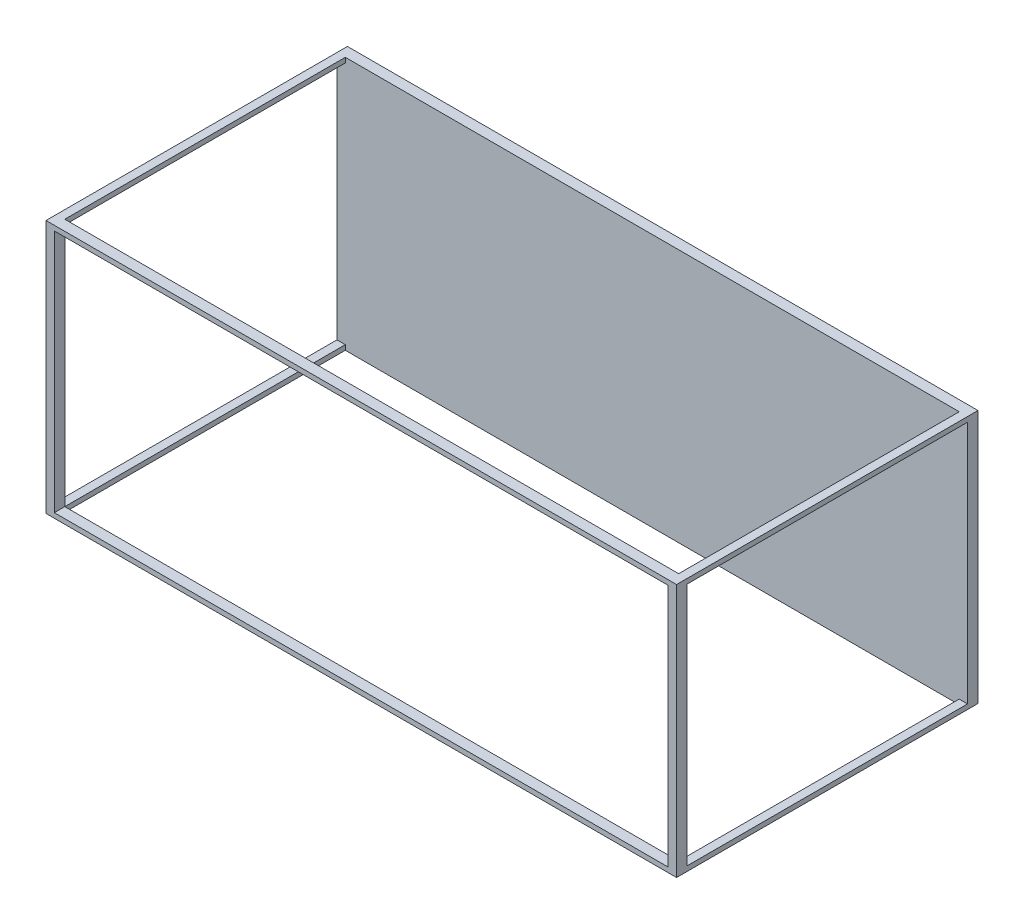
ISO-10303-21;
HEADER;
FILE_DESCRIPTION(('STEP AP214'),'2;1');
FILE_NAME('part.step','',(''),(''),'','','');
FILE_SCHEMA(('AUTOMOTIVE_DESIGN { 1 0 10303 214 1 1 1 1 }'));
ENDSEC;
DATA;
#1=APPLICATION_CONTEXT('core data for automotive mechanical design processes');
#2=APPLICATION_PROTOCOL_DEFINITION('international standard','automotive_design',2000,#1);
#3=PRODUCT_CONTEXT('',#1,'mechanical');
#4=PRODUCT('Part','Part','',(#3));
#5=PRODUCT_RELATED_PRODUCT_CATEGORY('part','',(#4));
#6=PRODUCT_DEFINITION_FORMATION('','',#4);
#7=PRODUCT_DEFINITION_CONTEXT('part definition',#1,'design');
#8=PRODUCT_DEFINITION('design','',#6,#7);
#9=PRODUCT_DEFINITION_SHAPE('','',#8);
#10=(LENGTH_UNIT() NAMED_UNIT(*) SI_UNIT(.MILLI.,.METRE.));
#11=(NAMED_UNIT(*) PLANE_ANGLE_UNIT() SI_UNIT($,.RADIAN.));
#12=(NAMED_UNIT(*) SI_UNIT($,.STERADIAN.) SOLID_ANGLE_UNIT());
#13=UNCERTAINTY_MEASURE_WITH_UNIT(LENGTH_MEASURE(1.E-05),#10,'distance_accuracy_value','');
#14=(GEOMETRIC_REPRESENTATION_CONTEXT(3) GLOBAL_UNCERTAINTY_ASSIGNED_CONTEXT((#13)) GLOBAL_UNIT_ASSIGNED_CONTEXT((#10,
#11,#12)) REPRESENTATION_CONTEXT('',''));
#15=CARTESIAN_POINT('',(0.,0.,0.));
#16=DIRECTION('',(0.,0.,1.));
#17=DIRECTION('',(1.,0.,0.));
#18=AXIS2_PLACEMENT_3D('',#15,#16,#17);
#19=CARTESIAN_POINT('',(-2964.25801526717,1439.12366412214,0.));
#20=DIRECTION('',(1.,0.,0.));
#21=DIRECTION('',(0.,0.,-1.));
#22=AXIS2_PLACEMENT_3D('',#19,#20,#21);
#23=PLANE('',#22);
#24=DIRECTION('',(0.,0.,-1.));
#25=VECTOR('',#24,1.);
#26=CARTESIAN_POINT('',(-2964.25801526717,-951.876335877863,2.95496465886317E-13));
#27=LINE('',#26,#25);
#28=CARTESIAN_POINT('',(-2964.25801526718,-951.876335877863,2795.5));
#29=VERTEX_POINT('',#28);
#30=CARTESIAN_POINT('',(-2964.25801526718,-951.876335877863,100.500000000001));
#31=VERTEX_POINT('',#30);
#32=EDGE_CURVE('E210',#29,#31,#27,.T.);
#33=ORIENTED_EDGE('',*,*,#32,.F.);
#34=DIRECTION('',(0.,-1.,0.));
#35=VECTOR('',#34,1.);
#36=CARTESIAN_POINT('',(-2964.25801526717,1439.12366412214,2795.5));
#37=LINE('',#36,#35);
#38=CARTESIAN_POINT('',(-2964.25801526717,-998.876335877863,2795.5));
#39=VERTEX_POINT('',#38);
#40=EDGE_CURVE('E275',#29,#39,#37,.T.);
#41=ORIENTED_EDGE('',*,*,#40,.T.);
#42=DIRECTION('',(0.,0.,1.));
#43=VECTOR('',#42,1.);
#44=CARTESIAN_POINT('',(-2964.25801526717,-998.876335877863,0.));
#45=LINE('',#44,#43);
#46=CARTESIAN_POINT('',(-2964.25801526717,-998.876335877863,100.5));
#47=VERTEX_POINT('',#46);
#48=EDGE_CURVE('E248',#47,#39,#45,.T.);
#49=ORIENTED_EDGE('',*,*,#48,.F.);
#50=DIRECTION('',(0.,-1.,0.));
#51=VECTOR('',#50,1.);
#52=CARTESIAN_POINT('',(-2964.25801526717,1439.12366412214,100.5));
#53=LINE('',#52,#51);
#54=EDGE_CURVE('E271',#31,#47,#53,.T.);
#55=ORIENTED_EDGE('',*,*,#54,.F.);
#56=EDGE_LOOP('',(#33,#41,#49,#55));
#57=FACE_BOUND('',#56,.T.);
#58=ADVANCED_FACE('F36',(#57),#23,.T.);
#59=DIRECTION('',(0.,-1.,0.));
#60=VECTOR('',#59,1.);
#61=CARTESIAN_POINT('',(-2964.25801526717,1439.12366412214,2795.5));
#62=LINE('',#61,#60);
#63=CARTESIAN_POINT('',(-2964.25801526718,1392.12366412214,2795.5));
#64=VERTEX_POINT('',#63);
#65=EDGE_CURVE('E197',#64,#29,#62,.T.);
#66=ORIENTED_EDGE('',*,*,#65,.F.);
#67=DIRECTION('',(0.,0.,-1.));
#68=VECTOR('',#67,1.);
#69=CARTESIAN_POINT('',(-2964.25801526718,1392.12366412214,2896.000012));
#70=LINE('',#69,#68);
#71=CARTESIAN_POINT('',(-2964.25801526718,1392.12366412214,2896.));
#72=VERTEX_POINT('',#71);
#73=EDGE_CURVE('E218',#72,#64,#70,.T.);
#74=ORIENTED_EDGE('',*,*,#73,.F.);
#75=DIRECTION('',(0.,-1.,0.));
#76=VECTOR('',#75,1.);
#77=CARTESIAN_POINT('',(-2964.25801526718,-5.61601962368479E-13,2896.));
#78=LINE('',#77,#76);
#79=CARTESIAN_POINT('',(-2964.25801526718,-951.876335877862,2896.));
#80=VERTEX_POINT('',#79);
#81=EDGE_CURVE('E238',#72,#80,#78,.T.);
#82=ORIENTED_EDGE('',*,*,#81,.T.);
#83=DIRECTION('',(0.,0.,-1.));
#84=VECTOR('',#83,1.);
#85=CARTESIAN_POINT('',(-2964.25801526718,-951.876335877862,2896.000012));
#86=LINE('',#85,#84);
#87=EDGE_CURVE('E215',#80,#29,#86,.T.);
#88=ORIENTED_EDGE('',*,*,#87,.T.);
#89=EDGE_LOOP('',(#66,#74,#82,#88));
#90=FACE_BOUND('',#89,.T.);
#91=ADVANCED_FACE('F343',(#90),#23,.T.);
#92=CARTESIAN_POINT('',(2933.74198473283,1439.12366412214,0.));
#93=DIRECTION('',(1.,0.,0.));
#94=DIRECTION('',(0.,0.,-1.));
#95=AXIS2_PLACEMENT_3D('',#92,#93,#94);
#96=PLANE('',#95);
#97=DIRECTION('',(0.,-1.,0.));
#98=VECTOR('',#97,1.);
#99=CARTESIAN_POINT('',(2933.74198473283,1439.12366412214,2795.5));
#100=LINE('',#99,#98);
#101=CARTESIAN_POINT('',(2933.74198473282,-951.876335877861,2795.5));
#102=VERTEX_POINT('',#101);
#103=CARTESIAN_POINT('',(2933.74198473283,-998.876335877863,2795.5));
#104=VERTEX_POINT('',#103);
#105=EDGE_CURVE('E279',#102,#104,#100,.T.);
#106=ORIENTED_EDGE('',*,*,#105,.F.);
#107=DIRECTION('',(0.,0.,-1.));
#108=VECTOR('',#107,1.);
#109=CARTESIAN_POINT('',(2933.74198473283,-951.876335877862,2.95496465886317E-13));
#110=LINE('',#109,#108);
#111=CARTESIAN_POINT('',(2933.74198473283,-951.876335877862,100.500000000001));
#112=VERTEX_POINT('',#111);
#113=EDGE_CURVE('E11',#102,#112,#110,.T.);
#114=ORIENTED_EDGE('',*,*,#113,.T.);
#115=DIRECTION('',(0.,-1.,0.));
#116=VECTOR('',#115,1.);
#117=CARTESIAN_POINT('',(2933.74198473283,1439.12366412214,100.5));
#118=LINE('',#117,#116);
#119=CARTESIAN_POINT('',(2933.74198473282,-998.876335877863,100.5));
#120=VERTEX_POINT('',#119);
#121=EDGE_CURVE('E256',#112,#120,#118,.T.);
#122=ORIENTED_EDGE('',*,*,#121,.T.);
#123=DIRECTION('',(0.,0.,1.));
#124=VECTOR('',#123,1.);
#125=CARTESIAN_POINT('',(2933.74198473283,-998.876335877863,0.));
#126=LINE('',#125,#124);
#127=EDGE_CURVE('E259',#120,#104,#126,.T.);
#128=ORIENTED_EDGE('',*,*,#127,.T.);
#129=EDGE_LOOP('',(#106,#114,#122,#128));
#130=FACE_BOUND('',#129,.T.);
#131=ADVANCED_FACE('F395',(#130),#96,.F.);
#132=DIRECTION('',(0.,0.,-1.));
#133=VECTOR('',#132,1.);
#134=CARTESIAN_POINT('',(2933.74198473282,1392.12366412214,2896.000012));
#135=LINE('',#134,#133);
#136=CARTESIAN_POINT('',(2933.74198473282,1392.12366412214,2896.));
#137=VERTEX_POINT('',#136);
#138=CARTESIAN_POINT('',(2933.74198473282,1392.12366412214,2795.5));
#139=VERTEX_POINT('',#138);
#140=EDGE_CURVE('E221',#137,#139,#135,.T.);
#141=ORIENTED_EDGE('',*,*,#140,.T.);
#142=DIRECTION('',(0.,-1.,0.));
#143=VECTOR('',#142,1.);
#144=CARTESIAN_POINT('',(2933.74198473283,1439.12366412214,2795.5));
#145=LINE('',#144,#143);
#146=EDGE_CURVE('E170',#139,#102,#145,.T.);
#147=ORIENTED_EDGE('',*,*,#146,.T.);
#148=DIRECTION('',(0.,0.,-1.));
#149=VECTOR('',#148,1.);
#150=CARTESIAN_POINT('',(2933.74198473282,-951.876335877862,2896.000012));
#151=LINE('',#150,#149);
#152=CARTESIAN_POINT('',(2933.74198473282,-951.876335877862,2896.));
#153=VERTEX_POINT('',#152);
#154=EDGE_CURVE('E224',#153,#102,#151,.T.);
#155=ORIENTED_EDGE('',*,*,#154,.F.);
#156=DIRECTION('',(0.,-1.,0.));
#157=VECTOR('',#156,1.);
#158=CARTESIAN_POINT('',(2933.74198473282,0.,2896.));
#159=LINE('',#158,#157);
#160=EDGE_CURVE('E240',#137,#153,#159,.T.);
#161=ORIENTED_EDGE('',*,*,#160,.F.);
#162=EDGE_LOOP('',(#141,#147,#155,#161));
#163=FACE_BOUND('',#162,.T.);
#164=ADVANCED_FACE('F322',(#163),#96,.F.);
#165=CARTESIAN_POINT('',(0.,0.,2896.));
#166=DIRECTION('',(0.,0.,-1.));
#167=DIRECTION('',(-1.,0.,0.));
#168=AXIS2_PLACEMENT_3D('',#165,#166,#167);
#169=PLANE('',#168);
#170=DIRECTION('',(1.,0.,0.));
#171=VECTOR('',#170,1.);
#172=CARTESIAN_POINT('',(-3044.25801526718,-998.876335877863,2896.));
#173=LINE('',#172,#171);
#174=CARTESIAN_POINT('',(-3044.25801526718,-998.876335877863,2896.));
#175=VERTEX_POINT('',#174);
#176=CARTESIAN_POINT('',(3013.74198473282,-998.876335877863,2896.));
#177=VERTEX_POINT('',#176);
#178=EDGE_CURVE('E283',#175,#177,#173,.T.);
#179=ORIENTED_EDGE('',*,*,#178,.T.);
#180=DIRECTION('',(0.,-1.,0.));
#181=VECTOR('',#180,1.);
#182=CARTESIAN_POINT('',(3013.74198473282,1439.12366412214,2896.));
#183=LINE('',#182,#181);
#184=CARTESIAN_POINT('',(3013.74198473282,1439.12366412214,2896.));
#185=VERTEX_POINT('',#184);
#186=EDGE_CURVE('E285',#185,#177,#183,.T.);
#187=ORIENTED_EDGE('',*,*,#186,.F.);
#188=DIRECTION('',(1.,0.,0.));
#189=VECTOR('',#188,1.);
#190=CARTESIAN_POINT('',(-3044.25801526718,1439.12366412214,2896.));
#191=LINE('',#190,#189);
#192=CARTESIAN_POINT('',(-3044.25801526718,1439.12366412214,2896.));
#193=VERTEX_POINT('',#192);
#194=EDGE_CURVE('E289',#193,#185,#191,.T.);
#195=ORIENTED_EDGE('',*,*,#194,.F.);
#196=DIRECTION('',(0.,-1.,0.));
#197=VECTOR('',#196,1.);
#198=CARTESIAN_POINT('',(-3044.25801526718,1439.12366412214,2896.));
#199=LINE('',#198,#197);
#200=EDGE_CURVE('E292',#193,#175,#199,.T.);
#201=ORIENTED_EDGE('',*,*,#200,.T.);
#202=EDGE_LOOP('',(#179,#187,#195,#201));
#203=FACE_BOUND('',#202,.T.);
#204=DIRECTION('',(1.,0.,0.));
#205=VECTOR('',#204,1.);
#206=CARTESIAN_POINT('',(0.,-951.876335877862,2896.));
#207=LINE('',#206,#205);
#208=EDGE_CURVE('E236',#80,#153,#207,.T.);
#209=ORIENTED_EDGE('',*,*,#208,.F.);
#210=ORIENTED_EDGE('',*,*,#81,.F.);
#211=DIRECTION('',(1.,0.,0.));
#212=VECTOR('',#211,1.);
#213=CARTESIAN_POINT('',(0.,1392.12366412214,2896.));
#214=LINE('',#213,#212);
#215=EDGE_CURVE('E230',#72,#137,#214,.T.);
#216=ORIENTED_EDGE('',*,*,#215,.T.);
#217=ORIENTED_EDGE('',*,*,#160,.T.);
#218=EDGE_LOOP('',(#209,#210,#216,#217));
#219=FACE_BOUND('',#218,.T.);
#220=ADVANCED_FACE('F383',(#203,#219),#169,.F.);
#221=CARTESIAN_POINT('',(0.,1439.12366412214,2795.5));
#222=DIRECTION('',(0.,0.,-1.));
#223=DIRECTION('',(-1.,0.,0.));
#224=AXIS2_PLACEMENT_3D('',#221,#222,#223);
#225=PLANE('',#224);
#226=ORIENTED_EDGE('',*,*,#40,.F.);
#227=DIRECTION('',(1.,0.,0.));
#228=VECTOR('',#227,1.);
#229=CARTESIAN_POINT('',(0.,-951.876335877862,2795.5));
#230=LINE('',#229,#228);
#231=EDGE_CURVE('E233',#29,#102,#230,.T.);
#232=ORIENTED_EDGE('',*,*,#231,.T.);
#233=ORIENTED_EDGE('',*,*,#105,.T.);
#234=DIRECTION('',(1.,0.,0.));
#235=VECTOR('',#234,1.);
#236=CARTESIAN_POINT('',(0.,-998.876335877863,2795.5));
#237=LINE('',#236,#235);
#238=EDGE_CURVE('E262',#39,#104,#237,.T.);
#239=ORIENTED_EDGE('',*,*,#238,.F.);
#240=EDGE_LOOP('',(#226,#232,#233,#239));
#241=FACE_BOUND('',#240,.T.);
#242=ADVANCED_FACE('F354',(#241),#225,.T.);
#243=CARTESIAN_POINT('',(-3044.25801526718,-998.876335877863,2896.));
#244=DIRECTION('',(0.,1.,0.));
#245=DIRECTION('',(0.,0.,1.));
#246=AXIS2_PLACEMENT_3D('',#243,#244,#245);
#247=PLANE('',#246);
#248=ORIENTED_EDGE('',*,*,#127,.F.);
#249=DIRECTION('',(1.,0.,0.));
#250=VECTOR('',#249,1.);
#251=CARTESIAN_POINT('',(0.,-998.876335877863,100.5));
#252=LINE('',#251,#250);
#253=EDGE_CURVE('E243',#47,#120,#252,.T.);
#254=ORIENTED_EDGE('',*,*,#253,.F.);
#255=ORIENTED_EDGE('',*,*,#48,.T.);
#256=ORIENTED_EDGE('',*,*,#238,.T.);
#257=EDGE_LOOP('',(#248,#254,#255,#256));
#258=FACE_BOUND('',#257,.T.);
#259=DIRECTION('',(1.,0.,0.));
#260=VECTOR('',#259,1.);
#261=CARTESIAN_POINT('',(-3044.25801526718,-998.876335877863,0.));
#262=LINE('',#261,#260);
#263=CARTESIAN_POINT('',(-3044.25801526718,-998.876335877863,0.));
#264=VERTEX_POINT('',#263);
#265=CARTESIAN_POINT('',(3013.74198473282,-998.876335877863,0.));
#266=VERTEX_POINT('',#265);
#267=EDGE_CURVE('E270',#264,#266,#262,.T.);
#268=ORIENTED_EDGE('',*,*,#267,.T.);
#269=DIRECTION('',(0.,0.,-1.));
#270=VECTOR('',#269,1.);
#271=CARTESIAN_POINT('',(3013.74198473282,-998.876335877863,2896.));
#272=LINE('',#271,#270);
#273=EDGE_CURVE('E310',#177,#266,#272,.T.);
#274=ORIENTED_EDGE('',*,*,#273,.F.);
#275=ORIENTED_EDGE('',*,*,#178,.F.);
#276=DIRECTION('',(0.,0.,-1.));
#277=VECTOR('',#276,1.);
#278=CARTESIAN_POINT('',(-3044.25801526718,-998.876335877863,2896.));
#279=LINE('',#278,#277);
#280=EDGE_CURVE('E294',#175,#264,#279,.T.);
#281=ORIENTED_EDGE('',*,*,#280,.T.);
#282=EDGE_LOOP('',(#268,#274,#275,#281));
#283=FACE_BOUND('',#282,.T.);
#284=ADVANCED_FACE('F38',(#258,#283),#247,.F.);
#285=CARTESIAN_POINT('',(3013.74198473282,1439.12366412214,2896.));
#286=DIRECTION('',(1.,0.,0.));
#287=DIRECTION('',(0.,1.,0.));
#288=AXIS2_PLACEMENT_3D('',#285,#286,#287);
#289=PLANE('',#288);
#290=DIRECTION('',(0.,1.,0.));
#291=VECTOR('',#290,1.);
#292=CARTESIAN_POINT('',(3013.74198473282,1392.12366412214,2795.5));
#293=LINE('',#292,#291);
#294=CARTESIAN_POINT('',(3013.74198473282,-951.876335877861,2795.5));
#295=VERTEX_POINT('',#294);
#296=CARTESIAN_POINT('',(3013.74198473282,1392.12366412214,2795.5));
#297=VERTEX_POINT('',#296);
#298=EDGE_CURVE('E167',#295,#297,#293,.T.);
#299=ORIENTED_EDGE('',*,*,#298,.T.);
#300=DIRECTION('',(0.,0.,-1.));
#301=VECTOR('',#300,1.);
#302=CARTESIAN_POINT('',(3013.74198473282,1392.12366412214,2795.5));
#303=LINE('',#302,#301);
#304=CARTESIAN_POINT('',(3013.74198473282,1392.12366412214,100.5));
#305=VERTEX_POINT('',#304);
#306=EDGE_CURVE('E176',#297,#305,#303,.T.);
#307=ORIENTED_EDGE('',*,*,#306,.T.);
#308=DIRECTION('',(0.,-1.,0.));
#309=VECTOR('',#308,1.);
#310=CARTESIAN_POINT('',(3013.74198473282,1392.12366412214,100.5));
#311=LINE('',#310,#309);
#312=CARTESIAN_POINT('',(3013.74198473282,-951.876335877862,100.500000000001));
#313=VERTEX_POINT('',#312);
#314=EDGE_CURVE('E51',#305,#313,#311,.T.);
#315=ORIENTED_EDGE('',*,*,#314,.T.);
#316=DIRECTION('',(0.,0.,1.));
#317=VECTOR('',#316,1.);
#318=CARTESIAN_POINT('',(3013.74198473282,-951.876335877861,2795.5));
#319=LINE('',#318,#317);
#320=EDGE_CURVE('E184',#313,#295,#319,.T.);
#321=ORIENTED_EDGE('',*,*,#320,.T.);
#322=EDGE_LOOP('',(#299,#307,#315,#321));
#323=FACE_BOUND('',#322,.T.);
#324=DIRECTION('',(0.,-1.,0.));
#325=VECTOR('',#324,1.);
#326=CARTESIAN_POINT('',(3013.74198473282,1439.12366412214,0.));
#327=LINE('',#326,#325);
#328=CARTESIAN_POINT('',(3013.74198473282,1439.12366412214,0.));
#329=VERTEX_POINT('',#328);
#330=EDGE_CURVE('E297',#329,#266,#327,.T.);
#331=ORIENTED_EDGE('',*,*,#330,.F.);
#332=DIRECTION('',(0.,0.,-1.));
#333=VECTOR('',#332,1.);
#334=CARTESIAN_POINT('',(3013.74198473282,1439.12366412214,2896.));
#335=LINE('',#334,#333);
#336=EDGE_CURVE('E308',#185,#329,#335,.T.);
#337=ORIENTED_EDGE('',*,*,#336,.F.);
#338=ORIENTED_EDGE('',*,*,#186,.T.);
#339=ORIENTED_EDGE('',*,*,#273,.T.);
#340=EDGE_LOOP('',(#331,#337,#338,#339));
#341=FACE_BOUND('',#340,.T.);
#342=ADVANCED_FACE('F181',(#323,#341),#289,.T.);
#343=CARTESIAN_POINT('',(-3044.25801526718,1439.12366412214,2896.));
#344=DIRECTION('',(0.,1.,0.));
#345=DIRECTION('',(0.,0.,1.));
#346=AXIS2_PLACEMENT_3D('',#343,#344,#345);
#347=PLANE('',#346);
#348=DIRECTION('',(1.,0.,0.));
#349=VECTOR('',#348,1.);
#350=CARTESIAN_POINT('',(0.,1439.12366412214,100.5));
#351=LINE('',#350,#349);
#352=CARTESIAN_POINT('',(-2964.25801526717,1439.12366412214,100.5));
#353=VERTEX_POINT('',#352);
#354=CARTESIAN_POINT('',(2933.74198473283,1439.12366412214,100.5));
#355=VERTEX_POINT('',#354);
#356=EDGE_CURVE('E244',#353,#355,#351,.T.);
#357=ORIENTED_EDGE('',*,*,#356,.T.);
#358=DIRECTION('',(0.,0.,1.));
#359=VECTOR('',#358,1.);
#360=CARTESIAN_POINT('',(2933.74198473283,1439.12366412214,0.));
#361=LINE('',#360,#359);
#362=CARTESIAN_POINT('',(2933.74198473283,1439.12366412214,2795.5));
#363=VERTEX_POINT('',#362);
#364=EDGE_CURVE('E247',#355,#363,#361,.T.);
#365=ORIENTED_EDGE('',*,*,#364,.T.);
#366=DIRECTION('',(1.,0.,0.));
#367=VECTOR('',#366,1.);
#368=CARTESIAN_POINT('',(0.,1439.12366412214,2795.5));
#369=LINE('',#368,#367);
#370=CARTESIAN_POINT('',(-2964.25801526717,1439.12366412214,2795.5));
#371=VERTEX_POINT('',#370);
#372=EDGE_CURVE('E251',#371,#363,#369,.T.);
#373=ORIENTED_EDGE('',*,*,#372,.F.);
#374=DIRECTION('',(0.,0.,1.));
#375=VECTOR('',#374,1.);
#376=CARTESIAN_POINT('',(-2964.25801526717,1439.12366412214,0.));
#377=LINE('',#376,#375);
#378=EDGE_CURVE('E254',#353,#371,#377,.T.);
#379=ORIENTED_EDGE('',*,*,#378,.F.);
#380=EDGE_LOOP('',(#357,#365,#373,#379));
#381=FACE_BOUND('',#380,.T.);
#382=DIRECTION('',(1.,0.,0.));
#383=VECTOR('',#382,1.);
#384=CARTESIAN_POINT('',(-3044.25801526718,1439.12366412214,0.));
#385=LINE('',#384,#383);
#386=CARTESIAN_POINT('',(-3044.25801526718,1439.12366412214,0.));
#387=VERTEX_POINT('',#386);
#388=EDGE_CURVE('E300',#387,#329,#385,.T.);
#389=ORIENTED_EDGE('',*,*,#388,.F.);
#390=DIRECTION('',(0.,0.,-1.));
#391=VECTOR('',#390,1.);
#392=CARTESIAN_POINT('',(-3044.25801526718,1439.12366412214,2896.));
#393=LINE('',#392,#391);
#394=EDGE_CURVE('E306',#193,#387,#393,.T.);
#395=ORIENTED_EDGE('',*,*,#394,.F.);
#396=ORIENTED_EDGE('',*,*,#194,.T.);
#397=ORIENTED_EDGE('',*,*,#336,.T.);
#398=EDGE_LOOP('',(#389,#395,#396,#397));
#399=FACE_BOUND('',#398,.T.);
#400=ADVANCED_FACE('F328',(#381,#399),#347,.T.);
#401=CARTESIAN_POINT('',(-3044.25801526718,1439.12366412214,2896.));
#402=DIRECTION('',(1.,0.,0.));
#403=DIRECTION('',(0.,1.,0.));
#404=AXIS2_PLACEMENT_3D('',#401,#402,#403);
#405=PLANE('',#404);
#406=DIRECTION('',(0.,0.,1.));
#407=VECTOR('',#406,1.);
#408=CARTESIAN_POINT('',(-3044.25801526718,1392.12366412214,2896.));
#409=LINE('',#408,#407);
#410=CARTESIAN_POINT('',(-3044.25801526718,1392.12366412214,100.5));
#411=VERTEX_POINT('',#410);
#412=CARTESIAN_POINT('',(-3044.25801526718,1392.12366412214,2795.5));
#413=VERTEX_POINT('',#412);
#414=EDGE_CURVE('E204',#411,#413,#409,.T.);
#415=ORIENTED_EDGE('',*,*,#414,.T.);
#416=DIRECTION('',(0.,-1.,0.));
#417=VECTOR('',#416,1.);
#418=CARTESIAN_POINT('',(-3044.25801526718,1439.12366412214,2795.5));
#419=LINE('',#418,#417);
#420=CARTESIAN_POINT('',(-3044.25801526718,-951.876335877863,2795.5));
#421=VERTEX_POINT('',#420);
#422=EDGE_CURVE('E199',#413,#421,#419,.T.);
#423=ORIENTED_EDGE('',*,*,#422,.T.);
#424=DIRECTION('',(0.,0.,-1.));
#425=VECTOR('',#424,1.);
#426=CARTESIAN_POINT('',(-3044.25801526718,-951.876335877862,2896.));
#427=LINE('',#426,#425);
#428=CARTESIAN_POINT('',(-3044.25801526718,-951.876335877863,100.500000000001));
#429=VERTEX_POINT('',#428);
#430=EDGE_CURVE('E212',#421,#429,#427,.T.);
#431=ORIENTED_EDGE('',*,*,#430,.T.);
#432=DIRECTION('',(0.,1.,0.));
#433=VECTOR('',#432,1.);
#434=CARTESIAN_POINT('',(-3044.25801526718,1439.12366412214,100.5));
#435=LINE('',#434,#433);
#436=EDGE_CURVE('E207',#429,#411,#435,.T.);
#437=ORIENTED_EDGE('',*,*,#436,.T.);
#438=EDGE_LOOP('',(#415,#423,#431,#437));
#439=FACE_BOUND('',#438,.T.);
#440=DIRECTION('',(0.,-1.,0.));
#441=VECTOR('',#440,1.);
#442=CARTESIAN_POINT('',(-3044.25801526718,1439.12366412214,0.));
#443=LINE('',#442,#441);
#444=EDGE_CURVE('E286',#387,#264,#443,.T.);
#445=ORIENTED_EDGE('',*,*,#444,.T.);
#446=ORIENTED_EDGE('',*,*,#280,.F.);
#447=ORIENTED_EDGE('',*,*,#200,.F.);
#448=ORIENTED_EDGE('',*,*,#394,.T.);
#449=EDGE_LOOP('',(#445,#446,#447,#448));
#450=FACE_BOUND('',#449,.T.);
#451=ADVANCED_FACE('F365',(#439,#450),#405,.F.);
#452=CARTESIAN_POINT('',(0.,0.,0.));
#453=DIRECTION('',(0.,0.,-1.));
#454=DIRECTION('',(-1.,0.,0.));
#455=AXIS2_PLACEMENT_3D('',#452,#453,#454);
#456=PLANE('',#455);
#457=ORIENTED_EDGE('',*,*,#267,.F.);
#458=ORIENTED_EDGE('',*,*,#444,.F.);
#459=ORIENTED_EDGE('',*,*,#388,.T.);
#460=ORIENTED_EDGE('',*,*,#330,.T.);
#461=EDGE_LOOP('',(#457,#458,#459,#460));
#462=FACE_BOUND('',#461,.T.);
#463=ADVANCED_FACE('F368',(#462),#456,.T.);
#464=CARTESIAN_POINT('',(0.,1439.12366412214,100.5));
#465=DIRECTION('',(0.,0.,-1.));
#466=DIRECTION('',(-1.,0.,0.));
#467=AXIS2_PLACEMENT_3D('',#464,#465,#466);
#468=PLANE('',#467);
#469=CARTESIAN_POINT('',(-2964.25801526717,1392.12366412214,100.5));
#470=VERTEX_POINT('',#469);
#471=EDGE_CURVE('E267',#353,#470,#53,.T.);
#472=ORIENTED_EDGE('',*,*,#471,.T.);
#473=DIRECTION('',(-1.,0.,0.));
#474=VECTOR('',#473,1.);
#475=CARTESIAN_POINT('',(3013.74198473282,1392.12366412214,100.5));
#476=LINE('',#475,#474);
#477=EDGE_CURVE('E173',#470,#411,#476,.T.);
#478=ORIENTED_EDGE('',*,*,#477,.T.);
#479=ORIENTED_EDGE('',*,*,#436,.F.);
#480=DIRECTION('',(-1.,0.,0.));
#481=VECTOR('',#480,1.);
#482=CARTESIAN_POINT('',(3013.74198473282,-951.876335877862,100.500000000001));
#483=LINE('',#482,#481);
#484=EDGE_CURVE('E194',#31,#429,#483,.T.);
#485=ORIENTED_EDGE('',*,*,#484,.F.);
#486=ORIENTED_EDGE('',*,*,#54,.T.);
#487=ORIENTED_EDGE('',*,*,#253,.T.);
#488=ORIENTED_EDGE('',*,*,#121,.F.);
#489=EDGE_CURVE('E192',#313,#112,#483,.T.);
#490=ORIENTED_EDGE('',*,*,#489,.F.);
#491=ORIENTED_EDGE('',*,*,#314,.F.);
#492=CARTESIAN_POINT('',(2933.74198473283,1392.12366412214,100.5));
#493=VERTEX_POINT('',#492);
#494=EDGE_CURVE('E178',#305,#493,#476,.T.);
#495=ORIENTED_EDGE('',*,*,#494,.T.);
#496=EDGE_CURVE('E280',#355,#493,#118,.T.);
#497=ORIENTED_EDGE('',*,*,#496,.F.);
#498=ORIENTED_EDGE('',*,*,#356,.F.);
#499=EDGE_LOOP('',(#472,#478,#479,#485,#486,#487,#488,#490,#491,#495,#497,#498));
#500=FACE_BOUND('',#499,.T.);
#501=ADVANCED_FACE('F331',(#500),#468,.F.);
#502=DIRECTION('',(0.,0.,1.));
#503=VECTOR('',#502,1.);
#504=CARTESIAN_POINT('',(-2964.25801526717,1392.12366412214,0.));
#505=LINE('',#504,#503);
#506=EDGE_CURVE('E202',#470,#64,#505,.T.);
#507=ORIENTED_EDGE('',*,*,#506,.F.);
#508=ORIENTED_EDGE('',*,*,#471,.F.);
#509=ORIENTED_EDGE('',*,*,#378,.T.);
#510=EDGE_CURVE('E272',#371,#64,#37,.T.);
#511=ORIENTED_EDGE('',*,*,#510,.T.);
#512=EDGE_LOOP('',(#507,#508,#509,#511));
#513=FACE_BOUND('',#512,.T.);
#514=ADVANCED_FACE('F335',(#513),#23,.T.);
#515=DIRECTION('',(1.,0.,0.));
#516=VECTOR('',#515,1.);
#517=CARTESIAN_POINT('',(0.,1392.12366412214,2795.5));
#518=LINE('',#517,#516);
#519=EDGE_CURVE('E227',#64,#139,#518,.T.);
#520=ORIENTED_EDGE('',*,*,#519,.F.);
#521=ORIENTED_EDGE('',*,*,#510,.F.);
#522=ORIENTED_EDGE('',*,*,#372,.T.);
#523=EDGE_CURVE('E276',#363,#139,#100,.T.);
#524=ORIENTED_EDGE('',*,*,#523,.T.);
#525=EDGE_LOOP('',(#520,#521,#522,#524));
#526=FACE_BOUND('',#525,.T.);
#527=ADVANCED_FACE('F324',(#526),#225,.T.);
#528=ORIENTED_EDGE('',*,*,#496,.T.);
#529=DIRECTION('',(0.,0.,1.));
#530=VECTOR('',#529,1.);
#531=CARTESIAN_POINT('',(2933.74198473283,1392.12366412214,0.));
#532=LINE('',#531,#530);
#533=EDGE_CURVE('E44',#493,#139,#532,.T.);
#534=ORIENTED_EDGE('',*,*,#533,.T.);
#535=ORIENTED_EDGE('',*,*,#523,.F.);
#536=ORIENTED_EDGE('',*,*,#364,.F.);
#537=EDGE_LOOP('',(#528,#534,#535,#536));
#538=FACE_BOUND('',#537,.T.);
#539=ADVANCED_FACE('F312',(#538),#96,.F.);
#540=CARTESIAN_POINT('',(-2964.25801526718,-951.876335877862,2896.000012));
#541=DIRECTION('',(0.,1.,0.));
#542=DIRECTION('',(0.,0.,1.));
#543=AXIS2_PLACEMENT_3D('',#540,#541,#542);
#544=PLANE('',#543);
#545=ORIENTED_EDGE('',*,*,#208,.T.);
#546=ORIENTED_EDGE('',*,*,#154,.T.);
#547=ORIENTED_EDGE('',*,*,#231,.F.);
#548=ORIENTED_EDGE('',*,*,#87,.F.);
#549=EDGE_LOOP('',(#545,#546,#547,#548));
#550=FACE_BOUND('',#549,.T.);
#551=ADVANCED_FACE('F350',(#550),#544,.T.);
#552=CARTESIAN_POINT('',(-2964.25801526718,1392.12366412214,2896.000012));
#553=DIRECTION('',(0.,1.,0.));
#554=DIRECTION('',(0.,0.,1.));
#555=AXIS2_PLACEMENT_3D('',#552,#553,#554);
#556=PLANE('',#555);
#557=ORIENTED_EDGE('',*,*,#73,.T.);
#558=ORIENTED_EDGE('',*,*,#519,.T.);
#559=ORIENTED_EDGE('',*,*,#140,.F.);
#560=ORIENTED_EDGE('',*,*,#215,.F.);
#561=EDGE_LOOP('',(#557,#558,#559,#560));
#562=FACE_BOUND('',#561,.T.);
#563=ADVANCED_FACE('F317',(#562),#556,.F.);
#564=CARTESIAN_POINT('',(3013.74198473282,1392.12366412214,2795.5));
#565=DIRECTION('',(0.,1.,0.));
#566=DIRECTION('',(-1.,0.,0.));
#567=AXIS2_PLACEMENT_3D('',#564,#565,#566);
#568=PLANE('',#567);
#569=ORIENTED_EDGE('',*,*,#494,.F.);
#570=ORIENTED_EDGE('',*,*,#306,.F.);
#571=DIRECTION('',(-1.,0.,0.));
#572=VECTOR('',#571,1.);
#573=CARTESIAN_POINT('',(3013.74198473282,1392.12366412214,2795.5));
#574=LINE('',#573,#572);
#575=EDGE_CURVE('E162',#297,#139,#574,.T.);
#576=ORIENTED_EDGE('',*,*,#575,.T.);
#577=ORIENTED_EDGE('',*,*,#533,.F.);
#578=EDGE_LOOP('',(#569,#570,#576,#577));
#579=FACE_BOUND('',#578,.T.);
#580=ADVANCED_FACE('F177',(#579),#568,.F.);
#581=CARTESIAN_POINT('',(3013.74198473282,-951.876335877861,2795.5));
#582=DIRECTION('',(0.,-1.,0.));
#583=DIRECTION('',(1.,0.,0.));
#584=AXIS2_PLACEMENT_3D('',#581,#582,#583);
#585=PLANE('',#584);
#586=DIRECTION('',(-1.,0.,0.));
#587=VECTOR('',#586,1.);
#588=CARTESIAN_POINT('',(3013.74198473282,-951.876335877861,2795.5));
#589=LINE('',#588,#587);
#590=EDGE_CURVE('E189',#295,#102,#589,.T.);
#591=ORIENTED_EDGE('',*,*,#590,.F.);
#592=ORIENTED_EDGE('',*,*,#320,.F.);
#593=ORIENTED_EDGE('',*,*,#489,.T.);
#594=ORIENTED_EDGE('',*,*,#113,.F.);
#595=EDGE_LOOP('',(#591,#592,#593,#594));
#596=FACE_BOUND('',#595,.T.);
#597=ADVANCED_FACE('F433',(#596),#585,.F.);
#598=CARTESIAN_POINT('',(3013.74198473282,1392.12366412214,2795.5));
#599=DIRECTION('',(0.,0.,1.));
#600=DIRECTION('',(0.,-1.,0.));
#601=AXIS2_PLACEMENT_3D('',#598,#599,#600);
#602=PLANE('',#601);
#603=ORIENTED_EDGE('',*,*,#575,.F.);
#604=ORIENTED_EDGE('',*,*,#298,.F.);
#605=ORIENTED_EDGE('',*,*,#590,.T.);
#606=ORIENTED_EDGE('',*,*,#146,.F.);
#607=EDGE_LOOP('',(#603,#604,#605,#606));
#608=FACE_BOUND('',#607,.T.);
#609=ADVANCED_FACE('F164',(#608),#602,.F.);
#610=EDGE_CURVE('E191',#29,#421,#589,.T.);
#611=ORIENTED_EDGE('',*,*,#610,.F.);
#612=ORIENTED_EDGE('',*,*,#32,.T.);
#613=ORIENTED_EDGE('',*,*,#484,.T.);
#614=ORIENTED_EDGE('',*,*,#430,.F.);
#615=EDGE_LOOP('',(#611,#612,#613,#614));
#616=FACE_BOUND('',#615,.T.);
#617=ADVANCED_FACE('F363',(#616),#585,.F.);
#618=ORIENTED_EDGE('',*,*,#477,.F.);
#619=ORIENTED_EDGE('',*,*,#506,.T.);
#620=EDGE_CURVE('E59',#64,#413,#574,.T.);
#621=ORIENTED_EDGE('',*,*,#620,.T.);
#622=ORIENTED_EDGE('',*,*,#414,.F.);
#623=EDGE_LOOP('',(#618,#619,#621,#622));
#624=FACE_BOUND('',#623,.T.);
#625=ADVANCED_FACE('F336',(#624),#568,.F.);
#626=ORIENTED_EDGE('',*,*,#620,.F.);
#627=ORIENTED_EDGE('',*,*,#65,.T.);
#628=ORIENTED_EDGE('',*,*,#610,.T.);
#629=ORIENTED_EDGE('',*,*,#422,.F.);
#630=EDGE_LOOP('',(#626,#627,#628,#629));
#631=FACE_BOUND('',#630,.T.);
#632=ADVANCED_FACE('F339',(#631),#602,.F.);
#633=CLOSED_SHELL('',(#58,#91,#131,#164,#220,#242,#284,#342,#400,#451,#463,#501,#514,#527,#539,
#551,#563,#580,#597,#609,#617,#625,#632));
#634=MANIFOLD_SOLID_BREP('B2',#633);
#635=ADVANCED_BREP_SHAPE_REPRESENTATION('',(#18,#634),#14);
#636=SHAPE_DEFINITION_REPRESENTATION(#9,#635);
ENDSEC;
END-ISO-10303-21;
